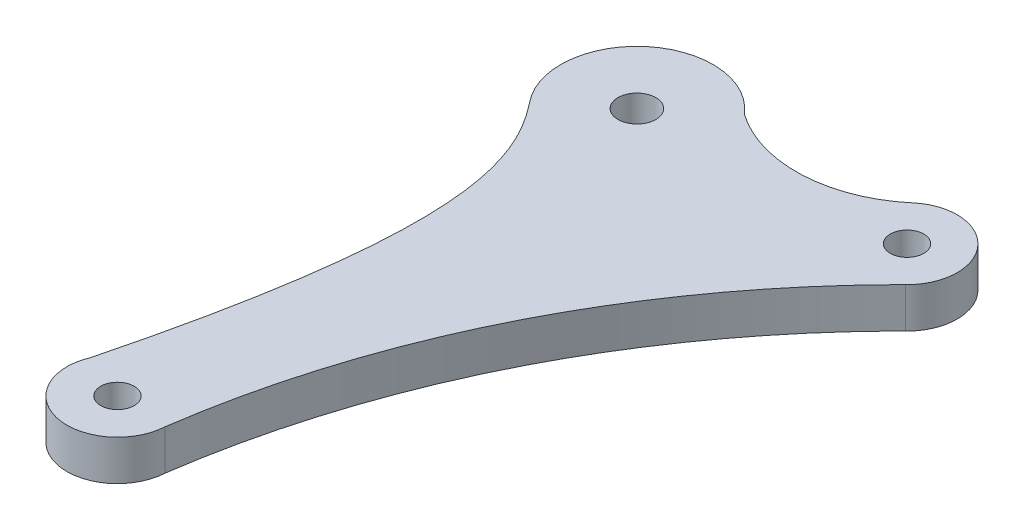
ISO-10303-21;
HEADER;
FILE_DESCRIPTION(('STEP AP214'),'2;1');
FILE_NAME('part.step','',(''),(''),'','','');
FILE_SCHEMA(('AUTOMOTIVE_DESIGN { 1 0 10303 214 1 1 1 1 }'));
ENDSEC;
DATA;
#1=APPLICATION_CONTEXT('core data for automotive mechanical design processes');
#2=APPLICATION_PROTOCOL_DEFINITION('international standard','automotive_design',2000,#1);
#3=PRODUCT_CONTEXT('',#1,'mechanical');
#4=PRODUCT('Part','Part','',(#3));
#5=PRODUCT_RELATED_PRODUCT_CATEGORY('part','',(#4));
#6=PRODUCT_DEFINITION_FORMATION('','',#4);
#7=PRODUCT_DEFINITION_CONTEXT('part definition',#1,'design');
#8=PRODUCT_DEFINITION('design','',#6,#7);
#9=PRODUCT_DEFINITION_SHAPE('','',#8);
#10=(LENGTH_UNIT() NAMED_UNIT(*) SI_UNIT(.MILLI.,.METRE.));
#11=(NAMED_UNIT(*) PLANE_ANGLE_UNIT() SI_UNIT($,.RADIAN.));
#12=(NAMED_UNIT(*) SI_UNIT($,.STERADIAN.) SOLID_ANGLE_UNIT());
#13=UNCERTAINTY_MEASURE_WITH_UNIT(LENGTH_MEASURE(1.E-05),#10,'distance_accuracy_value','');
#14=(GEOMETRIC_REPRESENTATION_CONTEXT(3) GLOBAL_UNCERTAINTY_ASSIGNED_CONTEXT((#13)) GLOBAL_UNIT_ASSIGNED_CONTEXT((#10,
#11,#12)) REPRESENTATION_CONTEXT('',''));
#15=CARTESIAN_POINT('',(0.,0.,0.));
#16=DIRECTION('',(0.,0.,1.));
#17=DIRECTION('',(1.,0.,0.));
#18=AXIS2_PLACEMENT_3D('',#15,#16,#17);
#19=CARTESIAN_POINT('',(5.46723314141844,3.175,-33.1844782850176));
#20=DIRECTION('',(0.,-1.,0.));
#21=DIRECTION('',(0.,0.,-1.));
#22=AXIS2_PLACEMENT_3D('',#19,#20,#21);
#23=PLANE('',#22);
#24=CARTESIAN_POINT('',(5.46723314141844,3.175,-33.1844782850176));
#25=DIRECTION('',(0.,-1.,0.));
#26=DIRECTION('',(0.,0.,-1.));
#27=AXIS2_PLACEMENT_3D('',#24,#25,#26);
#28=CIRCLE('',#27,10.4020557251875);
#29=CARTESIAN_POINT('',(12.2025960333805,3.175,-25.2574580363057));
#30=VERTEX_POINT('',#29);
#31=CARTESIAN_POINT('',(-0.514484420400793,3.175,-24.6743773267134));
#32=VERTEX_POINT('',#31);
#33=EDGE_CURVE('E144',#30,#32,#28,.T.);
#34=ORIENTED_EDGE('',*,*,#33,.T.);
#35=CARTESIAN_POINT('',(-5.13228796311219,3.175,-20.8166300644444));
#36=DIRECTION('',(0.,1.,0.));
#37=DIRECTION('',(0.,0.,1.));
#38=AXIS2_PLACEMENT_3D('',#35,#36,#37);
#39=CIRCLE('',#38,6.01716906016623);
#40=CARTESIAN_POINT('',(-9.75009150582359,3.175,-16.9588828021754));
#41=VERTEX_POINT('',#40);
#42=EDGE_CURVE('E87',#32,#41,#39,.T.);
#43=ORIENTED_EDGE('',*,*,#42,.T.);
#44=CARTESIAN_POINT('',(-9.75009150582359,3.175,-16.9588828021754));
#45=CARTESIAN_POINT('',(-6.38470535917021,3.175,-12.6733520486867));
#46=CARTESIAN_POINT('',(-3.58318049000808,3.175,-6.01015686092615));
#47=CARTESIAN_POINT('',(-9.66590226132941,3.175,17.7713120341668));
#48=B_SPLINE_CURVE_WITH_KNOTS('',3,(#44,#45,#46,#47),.UNSPECIFIED.,.F.,.F.,(4,4),(4.,5.),.UNSPECIFIED.);
#49=CARTESIAN_POINT('',(-9.66590226132941,3.175,17.7713120341668));
#50=VERTEX_POINT('',#49);
#51=EDGE_CURVE('E100',#41,#50,#48,.T.);
#52=ORIENTED_EDGE('',*,*,#51,.T.);
#53=CARTESIAN_POINT('',(-5.98903033423877,3.175,19.3304513583801));
#54=DIRECTION('',(0.,1.,0.));
#55=DIRECTION('',(0.,0.,1.));
#56=AXIS2_PLACEMENT_3D('',#53,#54,#55);
#57=CIRCLE('',#56,3.99378299367099);
#58=CARTESIAN_POINT('',(-2.0019977860121,3.175,19.5625592210579));
#59=VERTEX_POINT('',#58);
#60=EDGE_CURVE('E94',#50,#59,#57,.T.);
#61=ORIENTED_EDGE('',*,*,#60,.T.);
#62=CARTESIAN_POINT('',(-2.0019977860121,3.175,19.5625592210579));
#63=CARTESIAN_POINT('',(0.0965527287825115,3.175,4.7954637409853));
#64=CARTESIAN_POINT('',(6.9467458503323,3.175,-8.87513012586777));
#65=CARTESIAN_POINT('',(17.5134905911643,3.175,-19.3833763849603));
#66=B_SPLINE_CURVE_WITH_KNOTS('',3,(#62,#63,#64,#65),.UNSPECIFIED.,.F.,.F.,(4,4),(13.,14.),.UNSPECIFIED.);
#67=CARTESIAN_POINT('',(17.5134905911643,3.175,-19.3833763849603));
#68=VERTEX_POINT('',#67);
#69=EDGE_CURVE('E98',#59,#68,#66,.T.);
#70=ORIENTED_EDGE('',*,*,#69,.T.);
#71=CARTESIAN_POINT('',(14.7675972117228,3.175,-22.2386427764844));
#72=DIRECTION('',(0.,1.,0.));
#73=DIRECTION('',(0.,0.,1.));
#74=AXIS2_PLACEMENT_3D('',#71,#72,#73);
#75=CIRCLE('',#74,3.96137307228535);
#76=EDGE_CURVE('E50',#68,#30,#75,.T.);
#77=ORIENTED_EDGE('',*,*,#76,.T.);
#78=EDGE_LOOP('',(#34,#43,#52,#61,#70,#77));
#79=FACE_BOUND('',#78,.T.);
#80=CARTESIAN_POINT('',(-5.98903033423877,3.175,19.3304513583801));
#81=DIRECTION('',(0.,1.,0.));
#82=DIRECTION('',(0.,0.,1.));
#83=AXIS2_PLACEMENT_3D('',#80,#81,#82);
#84=CIRCLE('',#83,1.32443800057419);
#85=CARTESIAN_POINT('',(-5.98903033423877,3.175,20.6548893589543));
#86=VERTEX_POINT('',#85);
#87=EDGE_CURVE('E149',#86,#86,#84,.T.);
#88=ORIENTED_EDGE('',*,*,#87,.F.);
#89=EDGE_LOOP('',(#88));
#90=FACE_BOUND('',#89,.T.);
#91=CARTESIAN_POINT('',(14.7675972117228,3.175,-22.2386427764844));
#92=DIRECTION('',(0.,1.,0.));
#93=DIRECTION('',(0.,0.,1.));
#94=AXIS2_PLACEMENT_3D('',#91,#92,#93);
#95=CIRCLE('',#94,1.32420659774941);
#96=CARTESIAN_POINT('',(14.7675972117228,3.175,-20.914436178735));
#97=VERTEX_POINT('',#96);
#98=EDGE_CURVE('E150',#97,#97,#95,.T.);
#99=ORIENTED_EDGE('',*,*,#98,.F.);
#100=EDGE_LOOP('',(#99));
#101=FACE_BOUND('',#100,.T.);
#102=CARTESIAN_POINT('',(-5.13228796311219,3.175,-20.8166300644444));
#103=DIRECTION('',(0.,1.,0.));
#104=DIRECTION('',(0.,0.,1.));
#105=AXIS2_PLACEMENT_3D('',#102,#103,#104);
#106=CIRCLE('',#105,1.49759919286873);
#107=CARTESIAN_POINT('',(-5.13228796311219,3.175,-19.3190308715757));
#108=VERTEX_POINT('',#107);
#109=EDGE_CURVE('E157',#108,#108,#106,.T.);
#110=ORIENTED_EDGE('',*,*,#109,.F.);
#111=EDGE_LOOP('',(#110));
#112=FACE_BOUND('',#111,.T.);
#113=ADVANCED_FACE('F33',(#79,#90,#101,#112),#23,.F.);
#114=CARTESIAN_POINT('',(5.46723314141844,0.,-33.1844782850176));
#115=DIRECTION('',(0.,-1.,0.));
#116=DIRECTION('',(0.,0.,-1.));
#117=AXIS2_PLACEMENT_3D('',#114,#115,#116);
#118=PLANE('',#117);
#119=CARTESIAN_POINT('',(14.7675972117228,0.,-22.2386427764844));
#120=DIRECTION('',(0.,1.,0.));
#121=DIRECTION('',(0.,0.,1.));
#122=AXIS2_PLACEMENT_3D('',#119,#120,#121);
#123=CIRCLE('',#122,1.32420659774941);
#124=CARTESIAN_POINT('',(14.7675972117228,0.,-20.914436178735));
#125=VERTEX_POINT('',#124);
#126=EDGE_CURVE('E154',#125,#125,#123,.T.);
#127=ORIENTED_EDGE('',*,*,#126,.T.);
#128=EDGE_LOOP('',(#127));
#129=FACE_BOUND('',#128,.T.);
#130=CARTESIAN_POINT('',(5.46723314141844,0.,-33.1844782850176));
#131=DIRECTION('',(0.,-1.,0.));
#132=DIRECTION('',(0.,0.,-1.));
#133=AXIS2_PLACEMENT_3D('',#130,#131,#132);
#134=CIRCLE('',#133,10.4020557251875);
#135=CARTESIAN_POINT('',(12.2025960333805,0.,-25.2574580363057));
#136=VERTEX_POINT('',#135);
#137=CARTESIAN_POINT('',(-0.514484420400793,0.,-24.6743773267134));
#138=VERTEX_POINT('',#137);
#139=EDGE_CURVE('E153',#136,#138,#134,.T.);
#140=ORIENTED_EDGE('',*,*,#139,.F.);
#141=CARTESIAN_POINT('',(14.7675972117228,0.,-22.2386427764844));
#142=DIRECTION('',(0.,1.,0.));
#143=DIRECTION('',(0.,0.,1.));
#144=AXIS2_PLACEMENT_3D('',#141,#142,#143);
#145=CIRCLE('',#144,3.96137307228535);
#146=CARTESIAN_POINT('',(17.5134905911643,0.,-19.3833763849603));
#147=VERTEX_POINT('',#146);
#148=EDGE_CURVE('E79',#147,#136,#145,.T.);
#149=ORIENTED_EDGE('',*,*,#148,.F.);
#150=CARTESIAN_POINT('',(-2.0019977860121,0.,19.5625592210579));
#151=CARTESIAN_POINT('',(0.0965527287825115,0.,4.7954637409853));
#152=CARTESIAN_POINT('',(6.9467458503323,0.,-8.87513012586777));
#153=CARTESIAN_POINT('',(17.5134905911643,0.,-19.3833763849603));
#154=B_SPLINE_CURVE_WITH_KNOTS('',3,(#150,#151,#152,#153),.UNSPECIFIED.,.F.,.F.,(4,4),(13.,14.),.UNSPECIFIED.);
#155=CARTESIAN_POINT('',(-2.0019977860121,0.,19.5625592210579));
#156=VERTEX_POINT('',#155);
#157=EDGE_CURVE('E73',#156,#147,#154,.T.);
#158=ORIENTED_EDGE('',*,*,#157,.F.);
#159=CARTESIAN_POINT('',(-5.98903033423877,0.,19.3304513583801));
#160=DIRECTION('',(0.,1.,0.));
#161=DIRECTION('',(0.,0.,1.));
#162=AXIS2_PLACEMENT_3D('',#159,#160,#161);
#163=CIRCLE('',#162,3.99378299367099);
#164=CARTESIAN_POINT('',(-9.66590226132941,0.,17.7713120341668));
#165=VERTEX_POINT('',#164);
#166=EDGE_CURVE('E108',#165,#156,#163,.T.);
#167=ORIENTED_EDGE('',*,*,#166,.F.);
#168=CARTESIAN_POINT('',(-9.75009150582359,0.,-16.9588828021754));
#169=CARTESIAN_POINT('',(-6.38470535917021,0.,-12.6733520486867));
#170=CARTESIAN_POINT('',(-3.58318049000808,0.,-6.01015686092615));
#171=CARTESIAN_POINT('',(-9.66590226132941,0.,17.7713120341668));
#172=B_SPLINE_CURVE_WITH_KNOTS('',3,(#168,#169,#170,#171),.UNSPECIFIED.,.F.,.F.,(4,4),(4.,5.),.UNSPECIFIED.);
#173=CARTESIAN_POINT('',(-9.75009150582359,0.,-16.9588828021754));
#174=VERTEX_POINT('',#173);
#175=EDGE_CURVE('E260',#174,#165,#172,.T.);
#176=ORIENTED_EDGE('',*,*,#175,.F.);
#177=CARTESIAN_POINT('',(-5.13228796311219,0.,-20.8166300644444));
#178=DIRECTION('',(0.,1.,0.));
#179=DIRECTION('',(0.,0.,1.));
#180=AXIS2_PLACEMENT_3D('',#177,#178,#179);
#181=CIRCLE('',#180,6.01716906016623);
#182=EDGE_CURVE('E259',#138,#174,#181,.T.);
#183=ORIENTED_EDGE('',*,*,#182,.F.);
#184=EDGE_LOOP('',(#140,#149,#158,#167,#176,#183));
#185=FACE_BOUND('',#184,.T.);
#186=CARTESIAN_POINT('',(-5.98903033423877,0.,19.3304513583801));
#187=DIRECTION('',(0.,1.,0.));
#188=DIRECTION('',(0.,0.,1.));
#189=AXIS2_PLACEMENT_3D('',#186,#187,#188);
#190=CIRCLE('',#189,1.32443800057419);
#191=CARTESIAN_POINT('',(-5.98903033423877,0.,20.6548893589543));
#192=VERTEX_POINT('',#191);
#193=EDGE_CURVE('E146',#192,#192,#190,.T.);
#194=ORIENTED_EDGE('',*,*,#193,.T.);
#195=EDGE_LOOP('',(#194));
#196=FACE_BOUND('',#195,.T.);
#197=CARTESIAN_POINT('',(-5.13228796311219,0.,-20.8166300644444));
#198=DIRECTION('',(0.,1.,0.));
#199=DIRECTION('',(0.,0.,1.));
#200=AXIS2_PLACEMENT_3D('',#197,#198,#199);
#201=CIRCLE('',#200,1.49759919286873);
#202=CARTESIAN_POINT('',(-5.13228796311219,0.,-19.3190308715757));
#203=VERTEX_POINT('',#202);
#204=EDGE_CURVE('E160',#203,#203,#201,.T.);
#205=ORIENTED_EDGE('',*,*,#204,.T.);
#206=EDGE_LOOP('',(#205));
#207=FACE_BOUND('',#206,.T.);
#208=ADVANCED_FACE('F170',(#129,#185,#196,#207),#118,.T.);
#209=CARTESIAN_POINT('',(5.46723314141844,3.175,-33.1844782850176));
#210=DIRECTION('',(0.,-1.,0.));
#211=DIRECTION('',(0.,0.,-1.));
#212=AXIS2_PLACEMENT_3D('',#209,#210,#211);
#213=CYLINDRICAL_SURFACE('',#212,10.4020557251875);
#214=ORIENTED_EDGE('',*,*,#139,.T.);
#215=DIRECTION('',(0.,-1.,0.));
#216=VECTOR('',#215,1.);
#217=CARTESIAN_POINT('',(-0.514484420400793,3.175,-24.6743773267134));
#218=LINE('',#217,#216);
#219=EDGE_CURVE('E11',#32,#138,#218,.T.);
#220=ORIENTED_EDGE('',*,*,#219,.F.);
#221=ORIENTED_EDGE('',*,*,#33,.F.);
#222=DIRECTION('',(0.,-1.,0.));
#223=VECTOR('',#222,1.);
#224=CARTESIAN_POINT('',(12.2025960333805,3.175,-25.2574580363057));
#225=LINE('',#224,#223);
#226=EDGE_CURVE('E114',#30,#136,#225,.T.);
#227=ORIENTED_EDGE('',*,*,#226,.T.);
#228=EDGE_LOOP('',(#214,#220,#221,#227));
#229=FACE_BOUND('',#228,.T.);
#230=ADVANCED_FACE('F35',(#229),#213,.F.);
#231=CARTESIAN_POINT('',(-5.13228796311219,3.175,-20.8166300644444));
#232=DIRECTION('',(0.,-1.,0.));
#233=DIRECTION('',(0.,0.,-1.));
#234=AXIS2_PLACEMENT_3D('',#231,#232,#233);
#235=CYLINDRICAL_SURFACE('',#234,6.01716906016623);
#236=ORIENTED_EDGE('',*,*,#182,.T.);
#237=DIRECTION('',(0.,-1.,0.));
#238=VECTOR('',#237,1.);
#239=CARTESIAN_POINT('',(-9.75009150582359,3.175,-16.9588828021754));
#240=LINE('',#239,#238);
#241=EDGE_CURVE('E42',#41,#174,#240,.T.);
#242=ORIENTED_EDGE('',*,*,#241,.F.);
#243=ORIENTED_EDGE('',*,*,#42,.F.);
#244=ORIENTED_EDGE('',*,*,#219,.T.);
#245=EDGE_LOOP('',(#236,#242,#243,#244));
#246=FACE_BOUND('',#245,.T.);
#247=ADVANCED_FACE('F134',(#246),#235,.T.);
#248=DIRECTION('',(0.,-1.,0.));
#249=VECTOR('',#248,1.);
#250=SURFACE_OF_LINEAR_EXTRUSION('',#48,#249);
#251=ORIENTED_EDGE('',*,*,#175,.T.);
#252=DIRECTION('',(0.,-1.,0.));
#253=VECTOR('',#252,1.);
#254=CARTESIAN_POINT('',(-9.66590226132941,3.175,17.7713120341668));
#255=LINE('',#254,#253);
#256=EDGE_CURVE('E109',#50,#165,#255,.T.);
#257=ORIENTED_EDGE('',*,*,#256,.F.);
#258=ORIENTED_EDGE('',*,*,#51,.F.);
#259=ORIENTED_EDGE('',*,*,#241,.T.);
#260=EDGE_LOOP('',(#251,#257,#258,#259));
#261=FACE_BOUND('',#260,.T.);
#262=ADVANCED_FACE('F132',(#261),#250,.F.);
#263=CARTESIAN_POINT('',(-5.98903033423877,3.175,19.3304513583801));
#264=DIRECTION('',(0.,-1.,0.));
#265=DIRECTION('',(0.,0.,-1.));
#266=AXIS2_PLACEMENT_3D('',#263,#264,#265);
#267=CYLINDRICAL_SURFACE('',#266,3.99378299367099);
#268=ORIENTED_EDGE('',*,*,#166,.T.);
#269=DIRECTION('',(0.,-1.,0.));
#270=VECTOR('',#269,1.);
#271=CARTESIAN_POINT('',(-2.0019977860121,3.175,19.5625592210579));
#272=LINE('',#271,#270);
#273=EDGE_CURVE('E105',#59,#156,#272,.T.);
#274=ORIENTED_EDGE('',*,*,#273,.F.);
#275=ORIENTED_EDGE('',*,*,#60,.F.);
#276=ORIENTED_EDGE('',*,*,#256,.T.);
#277=EDGE_LOOP('',(#268,#274,#275,#276));
#278=FACE_BOUND('',#277,.T.);
#279=ADVANCED_FACE('F106',(#278),#267,.T.);
#280=DIRECTION('',(0.,-1.,0.));
#281=VECTOR('',#280,1.);
#282=SURFACE_OF_LINEAR_EXTRUSION('',#66,#281);
#283=ORIENTED_EDGE('',*,*,#157,.T.);
#284=DIRECTION('',(0.,-1.,0.));
#285=VECTOR('',#284,1.);
#286=CARTESIAN_POINT('',(17.5134905911643,3.175,-19.3833763849603));
#287=LINE('',#286,#285);
#288=EDGE_CURVE('E110',#68,#147,#287,.T.);
#289=ORIENTED_EDGE('',*,*,#288,.F.);
#290=ORIENTED_EDGE('',*,*,#69,.F.);
#291=ORIENTED_EDGE('',*,*,#273,.T.);
#292=EDGE_LOOP('',(#283,#289,#290,#291));
#293=FACE_BOUND('',#292,.T.);
#294=ADVANCED_FACE('F112',(#293),#282,.F.);
#295=CARTESIAN_POINT('',(14.7675972117228,3.175,-22.2386427764844));
#296=DIRECTION('',(0.,-1.,0.));
#297=DIRECTION('',(0.,0.,-1.));
#298=AXIS2_PLACEMENT_3D('',#295,#296,#297);
#299=CYLINDRICAL_SURFACE('',#298,3.96137307228535);
#300=ORIENTED_EDGE('',*,*,#148,.T.);
#301=ORIENTED_EDGE('',*,*,#226,.F.);
#302=ORIENTED_EDGE('',*,*,#76,.F.);
#303=ORIENTED_EDGE('',*,*,#288,.T.);
#304=EDGE_LOOP('',(#300,#301,#302,#303));
#305=FACE_BOUND('',#304,.T.);
#306=ADVANCED_FACE('F128',(#305),#299,.T.);
#307=CARTESIAN_POINT('',(-5.98903033423877,3.175,19.3304513583801));
#308=DIRECTION('',(0.,-1.,0.));
#309=DIRECTION('',(0.,0.,-1.));
#310=AXIS2_PLACEMENT_3D('',#307,#308,#309);
#311=CYLINDRICAL_SURFACE('',#310,1.32443800057419);
#312=ORIENTED_EDGE('',*,*,#87,.T.);
#313=EDGE_LOOP('',(#312));
#314=FACE_BOUND('',#313,.T.);
#315=ORIENTED_EDGE('',*,*,#193,.F.);
#316=EDGE_LOOP('',(#315));
#317=FACE_BOUND('',#316,.T.);
#318=ADVANCED_FACE('F177',(#314,#317),#311,.F.);
#319=CARTESIAN_POINT('',(14.7675972117228,3.175,-22.2386427764844));
#320=DIRECTION('',(0.,-1.,0.));
#321=DIRECTION('',(0.,0.,-1.));
#322=AXIS2_PLACEMENT_3D('',#319,#320,#321);
#323=CYLINDRICAL_SURFACE('',#322,1.32420659774941);
#324=ORIENTED_EDGE('',*,*,#98,.T.);
#325=EDGE_LOOP('',(#324));
#326=FACE_BOUND('',#325,.T.);
#327=ORIENTED_EDGE('',*,*,#126,.F.);
#328=EDGE_LOOP('',(#327));
#329=FACE_BOUND('',#328,.T.);
#330=ADVANCED_FACE('F180',(#326,#329),#323,.F.);
#331=CARTESIAN_POINT('',(-5.13228796311219,3.175,-20.8166300644444));
#332=DIRECTION('',(0.,-1.,0.));
#333=DIRECTION('',(0.,0.,-1.));
#334=AXIS2_PLACEMENT_3D('',#331,#332,#333);
#335=CYLINDRICAL_SURFACE('',#334,1.49759919286873);
#336=ORIENTED_EDGE('',*,*,#109,.T.);
#337=EDGE_LOOP('',(#336));
#338=FACE_BOUND('',#337,.T.);
#339=ORIENTED_EDGE('',*,*,#204,.F.);
#340=EDGE_LOOP('',(#339));
#341=FACE_BOUND('',#340,.T.);
#342=ADVANCED_FACE('F166',(#338,#341),#335,.F.);
#343=CLOSED_SHELL('',(#113,#208,#230,#247,#262,#279,#294,#306,#318,#330,#342));
#344=MANIFOLD_SOLID_BREP('B2',#343);
#345=ADVANCED_BREP_SHAPE_REPRESENTATION('',(#18,#344),#14);
#346=SHAPE_DEFINITION_REPRESENTATION(#9,#345);
ENDSEC;
END-ISO-10303-21;
